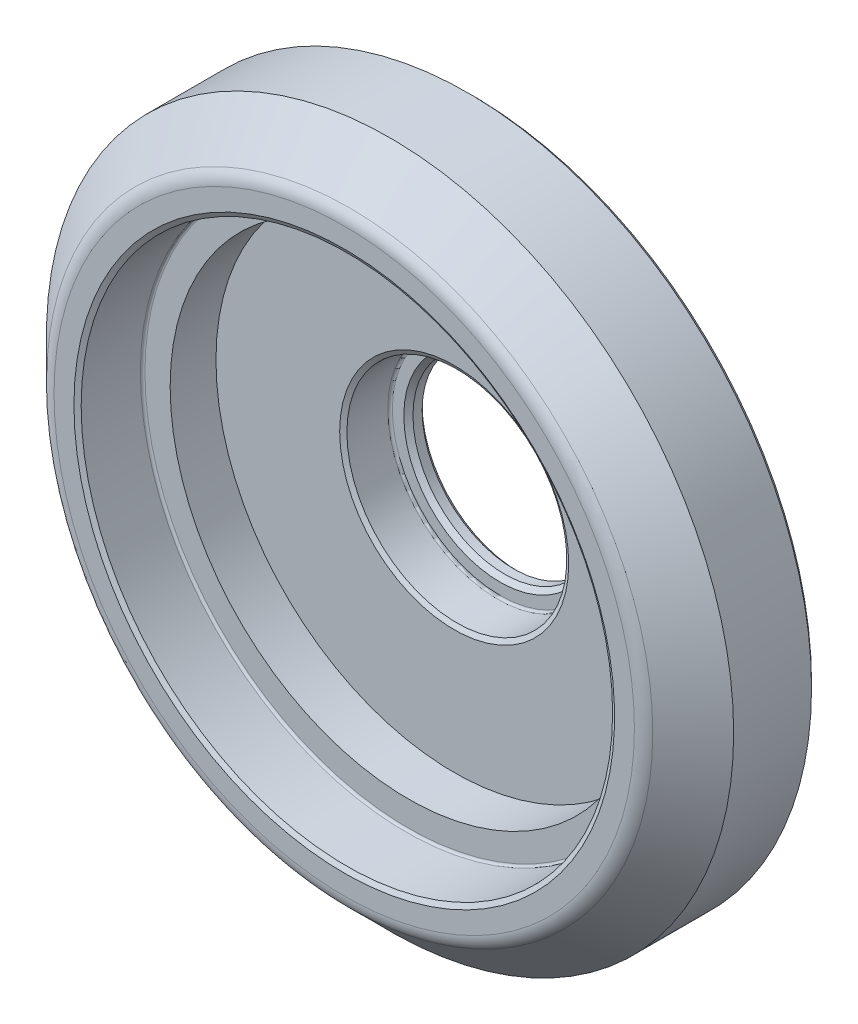
ISO-10303-21;
HEADER;
FILE_DESCRIPTION(('STEP AP214'),'2;1');
FILE_NAME('part.step','',(''),(''),'','','');
FILE_SCHEMA(('AUTOMOTIVE_DESIGN { 1 0 10303 214 1 1 1 1 }'));
ENDSEC;
DATA;
#1=APPLICATION_CONTEXT('core data for automotive mechanical design processes');
#2=APPLICATION_PROTOCOL_DEFINITION('international standard','automotive_design',2000,#1);
#3=PRODUCT_CONTEXT('',#1,'mechanical');
#4=PRODUCT('Part','Part','',(#3));
#5=PRODUCT_RELATED_PRODUCT_CATEGORY('part','',(#4));
#6=PRODUCT_DEFINITION_FORMATION('','',#4);
#7=PRODUCT_DEFINITION_CONTEXT('part definition',#1,'design');
#8=PRODUCT_DEFINITION('design','',#6,#7);
#9=PRODUCT_DEFINITION_SHAPE('','',#8);
#10=(LENGTH_UNIT() NAMED_UNIT(*) SI_UNIT(.MILLI.,.METRE.));
#11=(NAMED_UNIT(*) PLANE_ANGLE_UNIT() SI_UNIT($,.RADIAN.));
#12=(NAMED_UNIT(*) SI_UNIT($,.STERADIAN.) SOLID_ANGLE_UNIT());
#13=UNCERTAINTY_MEASURE_WITH_UNIT(LENGTH_MEASURE(1.E-05),#10,'distance_accuracy_value','');
#14=(GEOMETRIC_REPRESENTATION_CONTEXT(3) GLOBAL_UNCERTAINTY_ASSIGNED_CONTEXT((#13)) GLOBAL_UNIT_ASSIGNED_CONTEXT((#10,
#11,#12)) REPRESENTATION_CONTEXT('',''));
#15=CARTESIAN_POINT('',(0.,0.,0.));
#16=DIRECTION('',(0.,0.,1.));
#17=DIRECTION('',(1.,0.,0.));
#18=AXIS2_PLACEMENT_3D('',#15,#16,#17);
#19=CARTESIAN_POINT('',(0.,0.,26.8995098039216));
#20=DIRECTION('',(0.,0.,1.));
#21=DIRECTION('',(1.,0.,0.));
#22=AXIS2_PLACEMENT_3D('',#19,#20,#21);
#23=CYLINDRICAL_SURFACE('',#22,37.5);
#24=CARTESIAN_POINT('',(0.,0.,0.499999999999973));
#25=DIRECTION('',(0.,0.,1.));
#26=DIRECTION('',(1.,0.,0.));
#27=AXIS2_PLACEMENT_3D('',#24,#25,#26);
#28=CIRCLE('',#27,37.5);
#29=CARTESIAN_POINT('',(37.5,0.,0.499999999999973));
#30=VERTEX_POINT('',#29);
#31=EDGE_CURVE('E67',#30,#30,#28,.T.);
#32=ORIENTED_EDGE('',*,*,#31,.T.);
#33=EDGE_LOOP('',(#32));
#34=FACE_BOUND('',#33,.T.);
#35=CARTESIAN_POINT('',(0.,0.,9.));
#36=DIRECTION('',(0.,0.,1.));
#37=DIRECTION('',(1.,0.,0.));
#38=AXIS2_PLACEMENT_3D('',#35,#36,#37);
#39=CIRCLE('',#38,37.5);
#40=CARTESIAN_POINT('',(37.5,0.,9.));
#41=VERTEX_POINT('',#40);
#42=EDGE_CURVE('E113',#41,#41,#39,.T.);
#43=ORIENTED_EDGE('',*,*,#42,.F.);
#44=EDGE_LOOP('',(#43));
#45=FACE_BOUND('',#44,.T.);
#46=ADVANCED_FACE('F37',(#34,#45),#23,.T.);
#47=CARTESIAN_POINT('',(0.,37.5,0.));
#48=DIRECTION('',(0.,0.,1.));
#49=DIRECTION('',(1.,0.,0.));
#50=AXIS2_PLACEMENT_3D('',#47,#48,#49);
#51=PLANE('',#50);
#52=CARTESIAN_POINT('',(0.,0.,0.));
#53=DIRECTION('',(0.,0.,1.));
#54=DIRECTION('',(1.,0.,0.));
#55=AXIS2_PLACEMENT_3D('',#52,#53,#54);
#56=CIRCLE('',#55,37.);
#57=CARTESIAN_POINT('',(37.,0.,0.));
#58=VERTEX_POINT('',#57);
#59=EDGE_CURVE('E63',#58,#58,#56,.F.);
#60=ORIENTED_EDGE('',*,*,#59,.T.);
#61=EDGE_LOOP('',(#60));
#62=FACE_BOUND('',#61,.T.);
#63=CARTESIAN_POINT('',(0.,0.,0.));
#64=DIRECTION('',(0.,0.,1.));
#65=DIRECTION('',(1.,0.,0.));
#66=AXIS2_PLACEMENT_3D('',#63,#64,#65);
#67=CIRCLE('',#66,19.5);
#68=CARTESIAN_POINT('',(19.5,0.,0.));
#69=VERTEX_POINT('',#68);
#70=EDGE_CURVE('E104',#69,#69,#67,.T.);
#71=ORIENTED_EDGE('',*,*,#70,.T.);
#72=EDGE_LOOP('',(#71));
#73=FACE_BOUND('',#72,.T.);
#74=ADVANCED_FACE('F121',(#62,#73),#51,.F.);
#75=CARTESIAN_POINT('',(0.,0.,26.8995098039216));
#76=DIRECTION('',(0.,0.,1.));
#77=DIRECTION('',(1.,0.,0.));
#78=AXIS2_PLACEMENT_3D('',#75,#76,#77);
#79=CYLINDRICAL_SURFACE('',#78,17.5);
#80=CARTESIAN_POINT('',(0.,0.,-4.50000000000002));
#81=DIRECTION('',(0.,0.,-1.));
#82=DIRECTION('',(-1.,0.,0.));
#83=AXIS2_PLACEMENT_3D('',#80,#81,#82);
#84=CIRCLE('',#83,17.5);
#85=CARTESIAN_POINT('',(-17.5,0.,-4.50000000000002));
#86=VERTEX_POINT('',#85);
#87=EDGE_CURVE('E57',#86,#86,#84,.F.);
#88=ORIENTED_EDGE('',*,*,#87,.T.);
#89=EDGE_LOOP('',(#88));
#90=FACE_BOUND('',#89,.T.);
#91=CARTESIAN_POINT('',(0.,0.,-2.));
#92=DIRECTION('',(0.,0.,1.));
#93=DIRECTION('',(1.,0.,0.));
#94=AXIS2_PLACEMENT_3D('',#91,#92,#93);
#95=CIRCLE('',#94,17.5);
#96=CARTESIAN_POINT('',(17.5,0.,-2.));
#97=VERTEX_POINT('',#96);
#98=EDGE_CURVE('E101',#97,#97,#95,.F.);
#99=ORIENTED_EDGE('',*,*,#98,.T.);
#100=EDGE_LOOP('',(#99));
#101=FACE_BOUND('',#100,.T.);
#102=ADVANCED_FACE('F127',(#90,#101),#79,.T.);
#103=CARTESIAN_POINT('',(0.,0.,26.8995098039216));
#104=DIRECTION('',(0.,0.,1.));
#105=DIRECTION('',(1.,0.,0.));
#106=AXIS2_PLACEMENT_3D('',#103,#104,#105);
#107=CYLINDRICAL_SURFACE('',#106,12.);
#108=CARTESIAN_POINT('',(0.,0.,-2.75));
#109=DIRECTION('',(0.,0.,-1.));
#110=DIRECTION('',(-1.,0.,0.));
#111=AXIS2_PLACEMENT_3D('',#108,#109,#110);
#112=CIRCLE('',#111,12.);
#113=CARTESIAN_POINT('',(-12.,0.,-2.75));
#114=VERTEX_POINT('',#113);
#115=EDGE_CURVE('E10',#114,#114,#112,.T.);
#116=ORIENTED_EDGE('',*,*,#115,.T.);
#117=EDGE_LOOP('',(#116));
#118=FACE_BOUND('',#117,.T.);
#119=CARTESIAN_POINT('',(0.,0.,1.71132486540518));
#120=DIRECTION('',(0.,0.,-1.));
#121=DIRECTION('',(-1.,0.,0.));
#122=AXIS2_PLACEMENT_3D('',#119,#120,#121);
#123=CIRCLE('',#122,12.);
#124=CARTESIAN_POINT('',(-12.,0.,1.71132486540518));
#125=VERTEX_POINT('',#124);
#126=EDGE_CURVE('E86',#125,#125,#123,.F.);
#127=ORIENTED_EDGE('',*,*,#126,.T.);
#128=EDGE_LOOP('',(#127));
#129=FACE_BOUND('',#128,.T.);
#130=ADVANCED_FACE('F191',(#118,#129),#107,.F.);
#131=CARTESIAN_POINT('',(0.,26.,2.));
#132=DIRECTION('',(0.,0.,-1.));
#133=DIRECTION('',(-1.,0.,0.));
#134=AXIS2_PLACEMENT_3D('',#131,#132,#133);
#135=PLANE('',#134);
#136=CARTESIAN_POINT('',(0.,0.,2.));
#137=DIRECTION('',(0.,0.,-1.));
#138=DIRECTION('',(-1.,0.,0.));
#139=AXIS2_PLACEMENT_3D('',#136,#137,#138);
#140=CIRCLE('',#139,12.5);
#141=CARTESIAN_POINT('',(-12.5,0.,2.));
#142=VERTEX_POINT('',#141);
#143=EDGE_CURVE('E83',#142,#142,#140,.T.);
#144=ORIENTED_EDGE('',*,*,#143,.T.);
#145=EDGE_LOOP('',(#144));
#146=FACE_BOUND('',#145,.T.);
#147=CARTESIAN_POINT('',(0.,0.,2.));
#148=DIRECTION('',(0.,0.,1.));
#149=DIRECTION('',(1.,0.,0.));
#150=AXIS2_PLACEMENT_3D('',#147,#148,#149);
#151=CIRCLE('',#150,26.);
#152=CARTESIAN_POINT('',(26.,0.,2.));
#153=VERTEX_POINT('',#152);
#154=EDGE_CURVE('E107',#153,#153,#151,.T.);
#155=ORIENTED_EDGE('',*,*,#154,.T.);
#156=EDGE_LOOP('',(#155));
#157=FACE_BOUND('',#156,.T.);
#158=ADVANCED_FACE('F185',(#146,#157),#135,.F.);
#159=CARTESIAN_POINT('',(0.,0.,26.8995098039216));
#160=DIRECTION('',(0.,0.,1.));
#161=DIRECTION('',(1.,0.,0.));
#162=AXIS2_PLACEMENT_3D('',#159,#160,#161);
#163=CYLINDRICAL_SURFACE('',#162,26.);
#164=ORIENTED_EDGE('',*,*,#154,.F.);
#165=EDGE_LOOP('',(#164));
#166=FACE_BOUND('',#165,.T.);
#167=CARTESIAN_POINT('',(0.,0.,7.));
#168=DIRECTION('',(0.,0.,1.));
#169=DIRECTION('',(1.,0.,0.));
#170=AXIS2_PLACEMENT_3D('',#167,#168,#169);
#171=CIRCLE('',#170,26.);
#172=CARTESIAN_POINT('',(26.,0.,7.));
#173=VERTEX_POINT('',#172);
#174=EDGE_CURVE('E110',#173,#173,#171,.T.);
#175=ORIENTED_EDGE('',*,*,#174,.T.);
#176=EDGE_LOOP('',(#175));
#177=FACE_BOUND('',#176,.T.);
#178=ADVANCED_FACE('F180',(#166,#177),#163,.F.);
#179=CARTESIAN_POINT('',(0.,29.,7.));
#180=DIRECTION('',(0.,0.,-1.));
#181=DIRECTION('',(-1.,0.,0.));
#182=AXIS2_PLACEMENT_3D('',#179,#180,#181);
#183=PLANE('',#182);
#184=CARTESIAN_POINT('',(0.,0.,7.));
#185=DIRECTION('',(0.,0.,-1.));
#186=DIRECTION('',(-1.,0.,0.));
#187=AXIS2_PLACEMENT_3D('',#184,#185,#186);
#188=CIRCLE('',#187,28.75);
#189=CARTESIAN_POINT('',(-28.75,0.,7.));
#190=VERTEX_POINT('',#189);
#191=EDGE_CURVE('E52',#190,#190,#188,.F.);
#192=ORIENTED_EDGE('',*,*,#191,.T.);
#193=EDGE_LOOP('',(#192));
#194=FACE_BOUND('',#193,.T.);
#195=ORIENTED_EDGE('',*,*,#174,.F.);
#196=EDGE_LOOP('',(#195));
#197=FACE_BOUND('',#196,.T.);
#198=ADVANCED_FACE('F176',(#194,#197),#183,.F.);
#199=CARTESIAN_POINT('',(0.,0.,26.8995098039216));
#200=DIRECTION('',(0.,0.,1.));
#201=DIRECTION('',(1.,0.,0.));
#202=AXIS2_PLACEMENT_3D('',#199,#200,#201);
#203=CYLINDRICAL_SURFACE('',#202,29.);
#204=CARTESIAN_POINT('',(0.,0.,7.25));
#205=DIRECTION('',(0.,0.,-1.));
#206=DIRECTION('',(-1.,0.,0.));
#207=AXIS2_PLACEMENT_3D('',#204,#205,#206);
#208=CIRCLE('',#207,29.);
#209=CARTESIAN_POINT('',(-29.,0.,7.25));
#210=VERTEX_POINT('',#209);
#211=EDGE_CURVE('E48',#210,#210,#208,.T.);
#212=ORIENTED_EDGE('',*,*,#211,.T.);
#213=EDGE_LOOP('',(#212));
#214=FACE_BOUND('',#213,.T.);
#215=CARTESIAN_POINT('',(0.,0.,13.7113248654052));
#216=DIRECTION('',(0.,0.,-1.));
#217=DIRECTION('',(-1.,0.,0.));
#218=AXIS2_PLACEMENT_3D('',#215,#216,#217);
#219=CIRCLE('',#218,29.);
#220=CARTESIAN_POINT('',(-29.,0.,13.7113248654052));
#221=VERTEX_POINT('',#220);
#222=EDGE_CURVE('E92',#221,#221,#219,.F.);
#223=ORIENTED_EDGE('',*,*,#222,.T.);
#224=EDGE_LOOP('',(#223));
#225=FACE_BOUND('',#224,.T.);
#226=ADVANCED_FACE('F179',(#214,#225),#203,.F.);
#227=CARTESIAN_POINT('',(0.,32.5,14.));
#228=DIRECTION('',(0.,0.,-1.));
#229=DIRECTION('',(-1.,0.,0.));
#230=AXIS2_PLACEMENT_3D('',#227,#228,#229);
#231=PLANE('',#230);
#232=CARTESIAN_POINT('',(0.,0.,14.));
#233=DIRECTION('',(0.,0.,-1.));
#234=DIRECTION('',(-1.,0.,0.));
#235=AXIS2_PLACEMENT_3D('',#232,#233,#234);
#236=CIRCLE('',#235,29.5);
#237=CARTESIAN_POINT('',(-29.5,0.,14.));
#238=VERTEX_POINT('',#237);
#239=EDGE_CURVE('E89',#238,#238,#236,.T.);
#240=ORIENTED_EDGE('',*,*,#239,.T.);
#241=EDGE_LOOP('',(#240));
#242=FACE_BOUND('',#241,.T.);
#243=CARTESIAN_POINT('',(0.,0.,14.));
#244=DIRECTION('',(0.,0.,-1.));
#245=DIRECTION('',(-1.,0.,0.));
#246=AXIS2_PLACEMENT_3D('',#243,#244,#245);
#247=CIRCLE('',#246,31.6715728752538);
#248=CARTESIAN_POINT('',(-31.6715728752538,0.,14.));
#249=VERTEX_POINT('',#248);
#250=EDGE_CURVE('E98',#249,#249,#247,.F.);
#251=ORIENTED_EDGE('',*,*,#250,.T.);
#252=EDGE_LOOP('',(#251));
#253=FACE_BOUND('',#252,.T.);
#254=ADVANCED_FACE('F229',(#242,#253),#231,.F.);
#255=CARTESIAN_POINT('',(0.,0.,9.));
#256=DIRECTION('',(0.,0.,-1.));
#257=DIRECTION('',(-1.,0.,0.));
#258=AXIS2_PLACEMENT_3D('',#255,#256,#257);
#259=CONICAL_SURFACE('',#258,37.5,0.785398163397447);
#260=CARTESIAN_POINT('',(0.,0.,13.4142135623731));
#261=DIRECTION('',(0.,0.,1.));
#262=DIRECTION('',(1.,0.,0.));
#263=AXIS2_PLACEMENT_3D('',#260,#261,#262);
#264=CIRCLE('',#263,33.0857864376269);
#265=CARTESIAN_POINT('',(33.0857864376269,0.,13.4142135623731));
#266=VERTEX_POINT('',#265);
#267=EDGE_CURVE('E95',#266,#266,#264,.F.);
#268=ORIENTED_EDGE('',*,*,#267,.T.);
#269=EDGE_LOOP('',(#268));
#270=FACE_BOUND('',#269,.T.);
#271=ORIENTED_EDGE('',*,*,#42,.T.);
#272=EDGE_LOOP('',(#271));
#273=FACE_BOUND('',#272,.T.);
#274=ADVANCED_FACE('F118',(#270,#273),#259,.T.);
#275=CARTESIAN_POINT('',(0.,0.,-2.));
#276=DIRECTION('',(0.,0.,1.));
#277=DIRECTION('',(1.,0.,0.));
#278=AXIS2_PLACEMENT_3D('',#275,#276,#277);
#279=TOROIDAL_SURFACE('',#278,19.5,2.);
#280=ORIENTED_EDGE('',*,*,#98,.F.);
#281=EDGE_LOOP('',(#280));
#282=FACE_BOUND('',#281,.T.);
#283=ORIENTED_EDGE('',*,*,#70,.F.);
#284=EDGE_LOOP('',(#283));
#285=FACE_BOUND('',#284,.T.);
#286=ADVANCED_FACE('F132',(#282,#285),#279,.F.);
#287=CARTESIAN_POINT('',(0.,0.,12.));
#288=DIRECTION('',(0.,0.,-1.));
#289=DIRECTION('',(-1.,0.,0.));
#290=AXIS2_PLACEMENT_3D('',#287,#288,#289);
#291=TOROIDAL_SURFACE('',#290,31.6715728752538,2.);
#292=ORIENTED_EDGE('',*,*,#267,.F.);
#293=EDGE_LOOP('',(#292));
#294=FACE_BOUND('',#293,.T.);
#295=ORIENTED_EDGE('',*,*,#250,.F.);
#296=EDGE_LOOP('',(#295));
#297=FACE_BOUND('',#296,.T.);
#298=ADVANCED_FACE('F135',(#294,#297),#291,.T.);
#299=CARTESIAN_POINT('',(0.,0.,13.7113248654052));
#300=DIRECTION('',(0.,0.,1.));
#301=DIRECTION('',(1.,0.,0.));
#302=AXIS2_PLACEMENT_3D('',#299,#300,#301);
#303=CONICAL_SURFACE('',#302,29.,1.0471975511966);
#304=ORIENTED_EDGE('',*,*,#239,.F.);
#305=EDGE_LOOP('',(#304));
#306=FACE_BOUND('',#305,.T.);
#307=ORIENTED_EDGE('',*,*,#222,.F.);
#308=EDGE_LOOP('',(#307));
#309=FACE_BOUND('',#308,.T.);
#310=ADVANCED_FACE('F139',(#306,#309),#303,.F.);
#311=CARTESIAN_POINT('',(0.,0.,1.71132486540518));
#312=DIRECTION('',(0.,0.,1.));
#313=DIRECTION('',(1.,0.,0.));
#314=AXIS2_PLACEMENT_3D('',#311,#312,#313);
#315=CONICAL_SURFACE('',#314,12.,1.0471975511966);
#316=ORIENTED_EDGE('',*,*,#143,.F.);
#317=EDGE_LOOP('',(#316));
#318=FACE_BOUND('',#317,.T.);
#319=ORIENTED_EDGE('',*,*,#126,.F.);
#320=EDGE_LOOP('',(#319));
#321=FACE_BOUND('',#320,.T.);
#322=ADVANCED_FACE('F143',(#318,#321),#315,.F.);
#323=CARTESIAN_POINT('',(0.,0.,-3.));
#324=DIRECTION('',(0.,0.,-1.));
#325=DIRECTION('',(-1.,0.,0.));
#326=AXIS2_PLACEMENT_3D('',#323,#324,#325);
#327=PLANE('',#326);
#328=CARTESIAN_POINT('',(0.,0.,-3.));
#329=DIRECTION('',(0.,0.,-1.));
#330=DIRECTION('',(-1.,0.,0.));
#331=AXIS2_PLACEMENT_3D('',#328,#329,#330);
#332=CIRCLE('',#331,11.75);
#333=CARTESIAN_POINT('',(-11.75,0.,-3.));
#334=VERTEX_POINT('',#333);
#335=EDGE_CURVE('E44',#334,#334,#332,.F.);
#336=ORIENTED_EDGE('',*,*,#335,.T.);
#337=EDGE_LOOP('',(#336));
#338=FACE_BOUND('',#337,.T.);
#339=CARTESIAN_POINT('',(0.,0.,-3.));
#340=DIRECTION('',(0.,0.,-1.));
#341=DIRECTION('',(-1.,0.,0.));
#342=AXIS2_PLACEMENT_3D('',#339,#340,#341);
#343=CIRCLE('',#342,10.5);
#344=CARTESIAN_POINT('',(-10.5,0.,-3.));
#345=VERTEX_POINT('',#344);
#346=EDGE_CURVE('E80',#345,#345,#343,.T.);
#347=ORIENTED_EDGE('',*,*,#346,.T.);
#348=EDGE_LOOP('',(#347));
#349=FACE_BOUND('',#348,.T.);
#350=ADVANCED_FACE('F147',(#338,#349),#327,.F.);
#351=CARTESIAN_POINT('',(0.,0.,-5.));
#352=DIRECTION('',(0.,0.,-1.));
#353=DIRECTION('',(-1.,0.,0.));
#354=AXIS2_PLACEMENT_3D('',#351,#352,#353);
#355=PLANE('',#354);
#356=CARTESIAN_POINT('',(0.,0.,-5.));
#357=DIRECTION('',(0.,0.,-1.));
#358=DIRECTION('',(-1.,0.,0.));
#359=AXIS2_PLACEMENT_3D('',#356,#357,#358);
#360=CIRCLE('',#359,17.);
#361=CARTESIAN_POINT('',(-17.,0.,-5.));
#362=VERTEX_POINT('',#361);
#363=EDGE_CURVE('E60',#362,#362,#360,.T.);
#364=ORIENTED_EDGE('',*,*,#363,.T.);
#365=EDGE_LOOP('',(#364));
#366=FACE_BOUND('',#365,.T.);
#367=CARTESIAN_POINT('',(0.,0.,-5.));
#368=DIRECTION('',(0.,0.,-1.));
#369=DIRECTION('',(-1.,0.,0.));
#370=AXIS2_PLACEMENT_3D('',#367,#368,#369);
#371=CIRCLE('',#370,10.5);
#372=CARTESIAN_POINT('',(-10.5,0.,-5.));
#373=VERTEX_POINT('',#372);
#374=EDGE_CURVE('E71',#373,#373,#371,.F.);
#375=ORIENTED_EDGE('',*,*,#374,.T.);
#376=EDGE_LOOP('',(#375));
#377=FACE_BOUND('',#376,.T.);
#378=ADVANCED_FACE('F211',(#366,#377),#355,.T.);
#379=CARTESIAN_POINT('',(0.,0.,-5.));
#380=DIRECTION('',(0.,0.,1.));
#381=DIRECTION('',(1.,0.,0.));
#382=AXIS2_PLACEMENT_3D('',#379,#380,#381);
#383=CYLINDRICAL_SURFACE('',#382,10.);
#384=CARTESIAN_POINT('',(0.,0.,-3.5));
#385=DIRECTION('',(0.,0.,-1.));
#386=DIRECTION('',(-1.,0.,0.));
#387=AXIS2_PLACEMENT_3D('',#384,#385,#386);
#388=CIRCLE('',#387,10.);
#389=CARTESIAN_POINT('',(-10.,0.,-3.5));
#390=VERTEX_POINT('',#389);
#391=EDGE_CURVE('E74',#390,#390,#388,.F.);
#392=ORIENTED_EDGE('',*,*,#391,.T.);
#393=EDGE_LOOP('',(#392));
#394=FACE_BOUND('',#393,.T.);
#395=CARTESIAN_POINT('',(0.,0.,-4.49999999999999));
#396=DIRECTION('',(0.,0.,-1.));
#397=DIRECTION('',(-1.,0.,0.));
#398=AXIS2_PLACEMENT_3D('',#395,#396,#397);
#399=CIRCLE('',#398,10.);
#400=CARTESIAN_POINT('',(-10.,0.,-4.49999999999999));
#401=VERTEX_POINT('',#400);
#402=EDGE_CURVE('E77',#401,#401,#399,.T.);
#403=ORIENTED_EDGE('',*,*,#402,.T.);
#404=EDGE_LOOP('',(#403));
#405=FACE_BOUND('',#404,.T.);
#406=ADVANCED_FACE('F153',(#394,#405),#383,.F.);
#407=CARTESIAN_POINT('',(0.,0.,-3.));
#408=DIRECTION('',(0.,0.,1.));
#409=DIRECTION('',(1.,0.,0.));
#410=AXIS2_PLACEMENT_3D('',#407,#408,#409);
#411=CONICAL_SURFACE('',#410,10.5,0.785398163397441);
#412=ORIENTED_EDGE('',*,*,#391,.F.);
#413=EDGE_LOOP('',(#412));
#414=FACE_BOUND('',#413,.T.);
#415=ORIENTED_EDGE('',*,*,#346,.F.);
#416=EDGE_LOOP('',(#415));
#417=FACE_BOUND('',#416,.T.);
#418=ADVANCED_FACE('F149',(#414,#417),#411,.F.);
#419=CARTESIAN_POINT('',(0.,0.,-4.49999999999999));
#420=DIRECTION('',(0.,0.,-1.));
#421=DIRECTION('',(-1.,0.,0.));
#422=AXIS2_PLACEMENT_3D('',#419,#420,#421);
#423=CONICAL_SURFACE('',#422,10.,0.785398163397441);
#424=ORIENTED_EDGE('',*,*,#374,.F.);
#425=EDGE_LOOP('',(#424));
#426=FACE_BOUND('',#425,.T.);
#427=ORIENTED_EDGE('',*,*,#402,.F.);
#428=EDGE_LOOP('',(#427));
#429=FACE_BOUND('',#428,.T.);
#430=ADVANCED_FACE('F152',(#426,#429),#423,.F.);
#431=CARTESIAN_POINT('',(0.,0.,0.499999999999973));
#432=DIRECTION('',(0.,0.,1.));
#433=DIRECTION('',(1.,0.,0.));
#434=AXIS2_PLACEMENT_3D('',#431,#432,#433);
#435=CONICAL_SURFACE('',#434,37.5,0.785398163397455);
#436=ORIENTED_EDGE('',*,*,#59,.F.);
#437=EDGE_LOOP('',(#436));
#438=FACE_BOUND('',#437,.T.);
#439=ORIENTED_EDGE('',*,*,#31,.F.);
#440=EDGE_LOOP('',(#439));
#441=FACE_BOUND('',#440,.T.);
#442=ADVANCED_FACE('F157',(#438,#441),#435,.T.);
#443=CARTESIAN_POINT('',(0.,0.,-5.));
#444=DIRECTION('',(0.,0.,1.));
#445=DIRECTION('',(1.,0.,0.));
#446=AXIS2_PLACEMENT_3D('',#443,#444,#445);
#447=CONICAL_SURFACE('',#446,17.,0.785398163397448);
#448=ORIENTED_EDGE('',*,*,#87,.F.);
#449=EDGE_LOOP('',(#448));
#450=FACE_BOUND('',#449,.T.);
#451=ORIENTED_EDGE('',*,*,#363,.F.);
#452=EDGE_LOOP('',(#451));
#453=FACE_BOUND('',#452,.T.);
#454=ADVANCED_FACE('F161',(#450,#453),#447,.T.);
#455=CARTESIAN_POINT('',(0.,0.,7.25));
#456=DIRECTION('',(0.,0.,-1.));
#457=DIRECTION('',(-1.,0.,0.));
#458=AXIS2_PLACEMENT_3D('',#455,#456,#457);
#459=TOROIDAL_SURFACE('',#458,28.75,0.25);
#460=ORIENTED_EDGE('',*,*,#211,.F.);
#461=EDGE_LOOP('',(#460));
#462=FACE_BOUND('',#461,.T.);
#463=ORIENTED_EDGE('',*,*,#191,.F.);
#464=EDGE_LOOP('',(#463));
#465=FACE_BOUND('',#464,.T.);
#466=ADVANCED_FACE('F164',(#462,#465),#459,.F.);
#467=CARTESIAN_POINT('',(0.,0.,-2.75));
#468=DIRECTION('',(0.,0.,-1.));
#469=DIRECTION('',(-1.,0.,0.));
#470=AXIS2_PLACEMENT_3D('',#467,#468,#469);
#471=TOROIDAL_SURFACE('',#470,11.75,0.25);
#472=ORIENTED_EDGE('',*,*,#115,.F.);
#473=EDGE_LOOP('',(#472));
#474=FACE_BOUND('',#473,.T.);
#475=ORIENTED_EDGE('',*,*,#335,.F.);
#476=EDGE_LOOP('',(#475));
#477=FACE_BOUND('',#476,.T.);
#478=ADVANCED_FACE('F39',(#474,#477),#471,.F.);
#479=CLOSED_SHELL('',(#46,#74,#102,#130,#158,#178,#198,#226,#254,#274,#286,#298,#310,#322,#350,
#378,#406,#418,#430,#442,#454,#466,#478));
#480=MANIFOLD_SOLID_BREP('B2',#479);
#481=ADVANCED_BREP_SHAPE_REPRESENTATION('',(#18,#480),#14);
#482=SHAPE_DEFINITION_REPRESENTATION(#9,#481);
ENDSEC;
END-ISO-10303-21;
